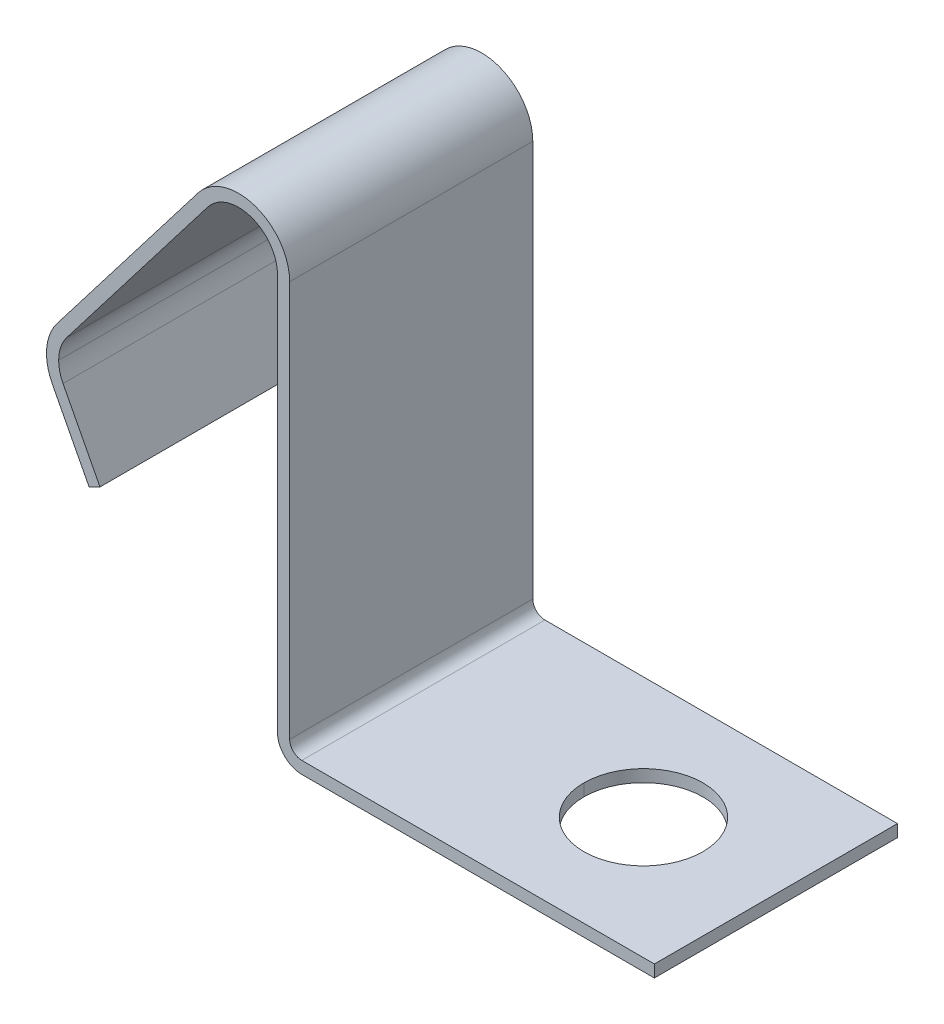
ISO-10303-21;
HEADER;
FILE_DESCRIPTION(('STEP AP214'),'2;1');
FILE_NAME('part.step','',(''),(''),'','','');
FILE_SCHEMA(('AUTOMOTIVE_DESIGN { 1 0 10303 214 1 1 1 1 }'));
ENDSEC;
DATA;
#1=APPLICATION_CONTEXT('core data for automotive mechanical design processes');
#2=APPLICATION_PROTOCOL_DEFINITION('international standard','automotive_design',2000,#1);
#3=PRODUCT_CONTEXT('',#1,'mechanical');
#4=PRODUCT('Part','Part','',(#3));
#5=PRODUCT_RELATED_PRODUCT_CATEGORY('part','',(#4));
#6=PRODUCT_DEFINITION_FORMATION('','',#4);
#7=PRODUCT_DEFINITION_CONTEXT('part definition',#1,'design');
#8=PRODUCT_DEFINITION('design','',#6,#7);
#9=PRODUCT_DEFINITION_SHAPE('','',#8);
#10=(LENGTH_UNIT() NAMED_UNIT(*) SI_UNIT(.MILLI.,.METRE.));
#11=(NAMED_UNIT(*) PLANE_ANGLE_UNIT() SI_UNIT($,.RADIAN.));
#12=(NAMED_UNIT(*) SI_UNIT($,.STERADIAN.) SOLID_ANGLE_UNIT());
#13=UNCERTAINTY_MEASURE_WITH_UNIT(LENGTH_MEASURE(1.E-05),#10,'distance_accuracy_value','');
#14=(GEOMETRIC_REPRESENTATION_CONTEXT(3) GLOBAL_UNCERTAINTY_ASSIGNED_CONTEXT((#13)) GLOBAL_UNIT_ASSIGNED_CONTEXT((#10,
#11,#12)) REPRESENTATION_CONTEXT('',''));
#15=CARTESIAN_POINT('',(0.,0.,0.));
#16=DIRECTION('',(0.,0.,1.));
#17=DIRECTION('',(1.,0.,0.));
#18=AXIS2_PLACEMENT_3D('',#15,#16,#17);
#19=CARTESIAN_POINT('',(-7.874,0.508,5.08));
#20=DIRECTION('',(-1.,0.,0.));
#21=DIRECTION('',(0.,0.,1.));
#22=AXIS2_PLACEMENT_3D('',#19,#20,#21);
#23=PLANE('',#22);
#24=DIRECTION('',(0.,1.,0.));
#25=VECTOR('',#24,1.);
#26=CARTESIAN_POINT('',(-7.874,0.508,5.08));
#27=LINE('',#26,#25);
#28=CARTESIAN_POINT('',(-7.874,0.508,5.08));
#29=VERTEX_POINT('',#28);
#30=CARTESIAN_POINT('',(-7.874,8.7884,5.08));
#31=VERTEX_POINT('',#30);
#32=EDGE_CURVE('E25',#29,#31,#27,.T.);
#33=ORIENTED_EDGE('',*,*,#32,.T.);
#34=DIRECTION('',(0.,0.,-1.));
#35=VECTOR('',#34,1.);
#36=CARTESIAN_POINT('',(-7.874,8.7884,5.08));
#37=LINE('',#36,#35);
#38=CARTESIAN_POINT('',(-7.874,8.7884,0.));
#39=VERTEX_POINT('',#38);
#40=EDGE_CURVE('E11',#31,#39,#37,.T.);
#41=ORIENTED_EDGE('',*,*,#40,.T.);
#42=DIRECTION('',(0.,-1.,0.));
#43=VECTOR('',#42,1.);
#44=CARTESIAN_POINT('',(-7.874,0.508,0.));
#45=LINE('',#44,#43);
#46=CARTESIAN_POINT('',(-7.874,0.508,0.));
#47=VERTEX_POINT('',#46);
#48=EDGE_CURVE('E407',#39,#47,#45,.T.);
#49=ORIENTED_EDGE('',*,*,#48,.T.);
#50=DIRECTION('',(0.,0.,1.));
#51=VECTOR('',#50,1.);
#52=CARTESIAN_POINT('',(-7.874,0.508,5.08));
#53=LINE('',#52,#51);
#54=EDGE_CURVE('E418',#47,#29,#53,.T.);
#55=ORIENTED_EDGE('',*,*,#54,.T.);
#56=EDGE_LOOP('',(#33,#41,#49,#55));
#57=FACE_BOUND('',#56,.T.);
#58=ADVANCED_FACE('F17',(#57),#23,.T.);
#59=CARTESIAN_POINT('',(-8.6868,8.7884,5.08));
#60=DIRECTION('',(0.,0.,-1.));
#61=DIRECTION('',(-1.,0.,0.));
#62=AXIS2_PLACEMENT_3D('',#59,#60,#61);
#63=CYLINDRICAL_SURFACE('',#62,0.8128);
#64=ORIENTED_EDGE('',*,*,#40,.F.);
#65=CARTESIAN_POINT('',(-8.6868,8.7884,5.08));
#66=DIRECTION('',(0.,0.,-1.));
#67=DIRECTION('',(-1.,0.,0.));
#68=AXIS2_PLACEMENT_3D('',#65,#66,#67);
#69=CIRCLE('',#68,0.8128);
#70=CARTESIAN_POINT('',(-9.33136201594556,9.2835602241701,5.08));
#71=VERTEX_POINT('',#70);
#72=EDGE_CURVE('E421',#71,#31,#69,.T.);
#73=ORIENTED_EDGE('',*,*,#72,.F.);
#74=DIRECTION('',(0.,0.,1.));
#75=VECTOR('',#74,1.);
#76=CARTESIAN_POINT('',(-9.33136201594557,9.2835602241701,5.08));
#77=LINE('',#76,#75);
#78=CARTESIAN_POINT('',(-9.33136201594556,9.2835602241701,0.));
#79=VERTEX_POINT('',#78);
#80=EDGE_CURVE('E400',#79,#71,#77,.T.);
#81=ORIENTED_EDGE('',*,*,#80,.F.);
#82=CARTESIAN_POINT('',(-8.6868,8.7884,0.));
#83=DIRECTION('',(0.,0.,1.));
#84=DIRECTION('',(-1.,0.,0.));
#85=AXIS2_PLACEMENT_3D('',#82,#83,#84);
#86=CIRCLE('',#85,0.8128);
#87=EDGE_CURVE('E411',#39,#79,#86,.T.);
#88=ORIENTED_EDGE('',*,*,#87,.F.);
#89=EDGE_LOOP('',(#64,#73,#81,#88));
#90=FACE_BOUND('',#89,.T.);
#91=ADVANCED_FACE('F428',(#90),#63,.F.);
#92=CARTESIAN_POINT('',(-7.366,0.254,5.08));
#93=DIRECTION('',(0.,0.,1.));
#94=DIRECTION('',(1.,0.,0.));
#95=AXIS2_PLACEMENT_3D('',#92,#93,#94);
#96=PLANE('',#95);
#97=DIRECTION('',(0.,1.,0.));
#98=VECTOR('',#97,1.);
#99=CARTESIAN_POINT('',(-7.62,0.254,5.08));
#100=LINE('',#99,#98);
#101=CARTESIAN_POINT('',(-7.62,0.508,5.08));
#102=VERTEX_POINT('',#101);
#103=CARTESIAN_POINT('',(-7.62,8.7884,5.08));
#104=VERTEX_POINT('',#103);
#105=EDGE_CURVE('E376',#102,#104,#100,.T.);
#106=ORIENTED_EDGE('',*,*,#105,.T.);
#107=CARTESIAN_POINT('',(-8.6868,8.7884,5.08));
#108=DIRECTION('',(0.,0.,1.));
#109=DIRECTION('',(-1.,0.,0.));
#110=AXIS2_PLACEMENT_3D('',#107,#108,#109);
#111=CIRCLE('',#110,1.0668);
#112=CARTESIAN_POINT('',(-9.53278764592855,9.43829779422325,5.08));
#113=VERTEX_POINT('',#112);
#114=EDGE_CURVE('E306',#104,#113,#111,.T.);
#115=ORIENTED_EDGE('',*,*,#114,.T.);
#116=DIRECTION('',(-0.609203031705345,-0.793014291271612,0.));
#117=VECTOR('',#116,1.);
#118=CARTESIAN_POINT('',(-9.53278764592855,9.43829779422325,5.08));
#119=LINE('',#118,#117);
#120=CARTESIAN_POINT('',(-12.4791876459286,5.60289779422326,5.08));
#121=VERTEX_POINT('',#120);
#122=EDGE_CURVE('E349',#113,#121,#119,.T.);
#123=ORIENTED_EDGE('',*,*,#122,.T.);
#124=CARTESIAN_POINT('',(-11.6332,4.953,5.08));
#125=DIRECTION('',(0.,0.,1.));
#126=DIRECTION('',(-1.,0.,0.));
#127=AXIS2_PLACEMENT_3D('',#124,#125,#126);
#128=CIRCLE('',#127,1.0668);
#129=CARTESIAN_POINT('',(-12.7,4.953,5.08));
#130=VERTEX_POINT('',#129);
#131=EDGE_CURVE('E322',#121,#130,#128,.T.);
#132=ORIENTED_EDGE('',*,*,#131,.T.);
#133=CARTESIAN_POINT('',(-11.6332,4.953,5.08));
#134=DIRECTION('',(0.,0.,1.));
#135=DIRECTION('',(-1.,0.,0.));
#136=AXIS2_PLACEMENT_3D('',#133,#134,#135);
#137=CIRCLE('',#136,1.0668);
#138=CARTESIAN_POINT('',(-12.5797372600589,4.46093348486189,5.08));
#139=VERTEX_POINT('',#138);
#140=EDGE_CURVE('E271',#130,#139,#137,.T.);
#141=ORIENTED_EDGE('',*,*,#140,.T.);
#142=DIRECTION('',(0.461254701104338,-0.887267772833629,0.));
#143=VECTOR('',#142,1.);
#144=CARTESIAN_POINT('',(-12.5797372600589,4.46093348486189,5.08));
#145=LINE('',#144,#143);
#146=CARTESIAN_POINT('',(-11.8077660142997,2.97597255920315,5.08));
#147=VERTEX_POINT('',#146);
#148=EDGE_CURVE('E276',#139,#147,#145,.T.);
#149=ORIENTED_EDGE('',*,*,#148,.T.);
#150=DIRECTION('',(-0.887267772833628,-0.46125470110434,0.));
#151=VECTOR('',#150,1.);
#152=CARTESIAN_POINT('',(-11.5824,3.09313125328365,5.08));
#153=LINE('',#152,#151);
#154=CARTESIAN_POINT('',(-11.5824,3.09313125328365,5.08));
#155=VERTEX_POINT('',#154);
#156=EDGE_CURVE('E263',#155,#147,#153,.T.);
#157=ORIENTED_EDGE('',*,*,#156,.F.);
#158=DIRECTION('',(0.461254701104338,-0.887267772833629,0.));
#159=VECTOR('',#158,1.);
#160=CARTESIAN_POINT('',(-12.3543712457592,4.57809217894239,5.08));
#161=LINE('',#160,#159);
#162=CARTESIAN_POINT('',(-12.3543712457592,4.57809217894239,5.08));
#163=VERTEX_POINT('',#162);
#164=EDGE_CURVE('E206',#163,#155,#161,.T.);
#165=ORIENTED_EDGE('',*,*,#164,.F.);
#166=CARTESIAN_POINT('',(-11.6332,4.953,5.08));
#167=DIRECTION('',(0.,0.,-1.));
#168=DIRECTION('',(-1.,0.,0.));
#169=AXIS2_PLACEMENT_3D('',#166,#167,#168);
#170=CIRCLE('',#169,0.8128);
#171=CARTESIAN_POINT('',(-12.446,4.953,5.08));
#172=VERTEX_POINT('',#171);
#173=EDGE_CURVE('E199',#163,#172,#170,.T.);
#174=ORIENTED_EDGE('',*,*,#173,.T.);
#175=CARTESIAN_POINT('',(-11.6332,4.953,5.08));
#176=DIRECTION('',(0.,0.,-1.));
#177=DIRECTION('',(-1.,0.,0.));
#178=AXIS2_PLACEMENT_3D('',#175,#176,#177);
#179=CIRCLE('',#178,0.8128);
#180=CARTESIAN_POINT('',(-12.2777620159456,5.4481602241701,5.08));
#181=VERTEX_POINT('',#180);
#182=EDGE_CURVE('E204',#172,#181,#179,.T.);
#183=ORIENTED_EDGE('',*,*,#182,.T.);
#184=DIRECTION('',(-0.609203031705345,-0.793014291271612,0.));
#185=VECTOR('',#184,1.);
#186=CARTESIAN_POINT('',(-9.33136201594556,9.2835602241701,5.08));
#187=LINE('',#186,#185);
#188=EDGE_CURVE('E393',#71,#181,#187,.T.);
#189=ORIENTED_EDGE('',*,*,#188,.F.);
#190=ORIENTED_EDGE('',*,*,#72,.T.);
#191=ORIENTED_EDGE('',*,*,#32,.F.);
#192=CARTESIAN_POINT('',(-7.366,0.508,5.08));
#193=DIRECTION('',(0.,0.,-1.));
#194=DIRECTION('',(-1.,0.,0.));
#195=AXIS2_PLACEMENT_3D('',#192,#193,#194);
#196=CIRCLE('',#195,0.508);
#197=CARTESIAN_POINT('',(-7.366,0.,5.08));
#198=VERTEX_POINT('',#197);
#199=EDGE_CURVE('E414',#198,#29,#196,.T.);
#200=ORIENTED_EDGE('',*,*,#199,.F.);
#201=DIRECTION('',(-1.,0.,0.));
#202=VECTOR('',#201,1.);
#203=CARTESIAN_POINT('',(0.,0.,5.08));
#204=LINE('',#203,#202);
#205=CARTESIAN_POINT('',(0.,0.,5.08));
#206=VERTEX_POINT('',#205);
#207=EDGE_CURVE('E248',#206,#198,#204,.T.);
#208=ORIENTED_EDGE('',*,*,#207,.F.);
#209=DIRECTION('',(0.,1.,0.));
#210=VECTOR('',#209,1.);
#211=CARTESIAN_POINT('',(0.,4.953,5.08));
#212=LINE('',#211,#210);
#213=CARTESIAN_POINT('',(0.,0.254,5.08));
#214=VERTEX_POINT('',#213);
#215=EDGE_CURVE('E254',#206,#214,#212,.T.);
#216=ORIENTED_EDGE('',*,*,#215,.T.);
#217=DIRECTION('',(-1.,0.,0.));
#218=VECTOR('',#217,1.);
#219=CARTESIAN_POINT('',(-11.6332,0.254,5.08));
#220=LINE('',#219,#218);
#221=CARTESIAN_POINT('',(-7.366,0.254,5.08));
#222=VERTEX_POINT('',#221);
#223=EDGE_CURVE('E334',#214,#222,#220,.T.);
#224=ORIENTED_EDGE('',*,*,#223,.T.);
#225=CARTESIAN_POINT('',(-7.366,0.508,5.08));
#226=DIRECTION('',(0.,0.,-1.));
#227=DIRECTION('',(-1.,0.,0.));
#228=AXIS2_PLACEMENT_3D('',#225,#226,#227);
#229=CIRCLE('',#228,0.254);
#230=EDGE_CURVE('E350',#222,#102,#229,.T.);
#231=ORIENTED_EDGE('',*,*,#230,.T.);
#232=EDGE_LOOP('',(#106,#115,#123,#132,#141,#149,#157,#165,#174,#183,#189,#190,#191,#200,#208,
#216,#224,#231));
#233=FACE_BOUND('',#232,.T.);
#234=ADVANCED_FACE('F201',(#233),#96,.T.);
#235=CARTESIAN_POINT('',(-7.366,0.508,5.08));
#236=DIRECTION('',(0.,0.,-1.));
#237=DIRECTION('',(-1.,0.,0.));
#238=AXIS2_PLACEMENT_3D('',#235,#236,#237);
#239=CYLINDRICAL_SURFACE('',#238,0.508);
#240=ORIENTED_EDGE('',*,*,#199,.T.);
#241=ORIENTED_EDGE('',*,*,#54,.F.);
#242=CARTESIAN_POINT('',(-7.366,0.508,0.));
#243=DIRECTION('',(0.,0.,1.));
#244=DIRECTION('',(-1.,0.,0.));
#245=AXIS2_PLACEMENT_3D('',#242,#243,#244);
#246=CIRCLE('',#245,0.508);
#247=CARTESIAN_POINT('',(-7.366,0.,0.));
#248=VERTEX_POINT('',#247);
#249=EDGE_CURVE('E404',#47,#248,#246,.T.);
#250=ORIENTED_EDGE('',*,*,#249,.T.);
#251=DIRECTION('',(0.,0.,1.));
#252=VECTOR('',#251,1.);
#253=CARTESIAN_POINT('',(-7.366,0.,5.08));
#254=LINE('',#253,#252);
#255=EDGE_CURVE('E252',#248,#198,#254,.T.);
#256=ORIENTED_EDGE('',*,*,#255,.T.);
#257=EDGE_LOOP('',(#240,#241,#250,#256));
#258=FACE_BOUND('',#257,.T.);
#259=ADVANCED_FACE('F439',(#258),#239,.T.);
#260=CARTESIAN_POINT('',(-9.53278764592855,9.43829779422325,0.));
#261=DIRECTION('',(0.,0.,-1.));
#262=DIRECTION('',(0.,-1.,0.));
#263=AXIS2_PLACEMENT_3D('',#260,#261,#262);
#264=PLANE('',#263);
#265=DIRECTION('',(0.,-1.,0.));
#266=VECTOR('',#265,1.);
#267=CARTESIAN_POINT('',(-7.62,9.43829779422325,0.));
#268=LINE('',#267,#266);
#269=CARTESIAN_POINT('',(-7.62,8.7884,0.));
#270=VERTEX_POINT('',#269);
#271=CARTESIAN_POINT('',(-7.62,0.508,0.));
#272=VERTEX_POINT('',#271);
#273=EDGE_CURVE('E390',#270,#272,#268,.T.);
#274=ORIENTED_EDGE('',*,*,#273,.T.);
#275=CARTESIAN_POINT('',(-7.366,0.508,0.));
#276=DIRECTION('',(0.,0.,1.));
#277=DIRECTION('',(-1.,0.,0.));
#278=AXIS2_PLACEMENT_3D('',#275,#276,#277);
#279=CIRCLE('',#278,0.254);
#280=CARTESIAN_POINT('',(-7.366,0.254,0.));
#281=VERTEX_POINT('',#280);
#282=EDGE_CURVE('E212',#272,#281,#279,.T.);
#283=ORIENTED_EDGE('',*,*,#282,.T.);
#284=DIRECTION('',(1.,0.,0.));
#285=VECTOR('',#284,1.);
#286=CARTESIAN_POINT('',(-7.62,0.254,0.));
#287=LINE('',#286,#285);
#288=CARTESIAN_POINT('',(0.,0.254,0.));
#289=VERTEX_POINT('',#288);
#290=EDGE_CURVE('E342',#281,#289,#287,.T.);
#291=ORIENTED_EDGE('',*,*,#290,.T.);
#292=DIRECTION('',(0.,1.,0.));
#293=VECTOR('',#292,1.);
#294=CARTESIAN_POINT('',(0.,0.254,0.));
#295=LINE('',#294,#293);
#296=CARTESIAN_POINT('',(0.,0.,0.));
#297=VERTEX_POINT('',#296);
#298=EDGE_CURVE('E297',#297,#289,#295,.T.);
#299=ORIENTED_EDGE('',*,*,#298,.F.);
#300=DIRECTION('',(1.,0.,0.));
#301=VECTOR('',#300,1.);
#302=CARTESIAN_POINT('',(0.,0.,0.));
#303=LINE('',#302,#301);
#304=EDGE_CURVE('E374',#248,#297,#303,.T.);
#305=ORIENTED_EDGE('',*,*,#304,.F.);
#306=ORIENTED_EDGE('',*,*,#249,.F.);
#307=ORIENTED_EDGE('',*,*,#48,.F.);
#308=ORIENTED_EDGE('',*,*,#87,.T.);
#309=DIRECTION('',(0.609203031705345,0.793014291271612,0.));
#310=VECTOR('',#309,1.);
#311=CARTESIAN_POINT('',(-9.33136201594556,9.2835602241701,0.));
#312=LINE('',#311,#310);
#313=CARTESIAN_POINT('',(-12.2777620159456,5.4481602241701,0.));
#314=VERTEX_POINT('',#313);
#315=EDGE_CURVE('E396',#314,#79,#312,.T.);
#316=ORIENTED_EDGE('',*,*,#315,.F.);
#317=CARTESIAN_POINT('',(-11.6332,4.953,0.));
#318=DIRECTION('',(0.,0.,1.));
#319=DIRECTION('',(-1.,0.,0.));
#320=AXIS2_PLACEMENT_3D('',#317,#318,#319);
#321=CIRCLE('',#320,0.8128);
#322=CARTESIAN_POINT('',(-12.446,4.953,0.));
#323=VERTEX_POINT('',#322);
#324=EDGE_CURVE('E221',#314,#323,#321,.T.);
#325=ORIENTED_EDGE('',*,*,#324,.T.);
#326=CARTESIAN_POINT('',(-11.6332,4.953,0.));
#327=DIRECTION('',(0.,0.,1.));
#328=DIRECTION('',(-1.,0.,0.));
#329=AXIS2_PLACEMENT_3D('',#326,#327,#328);
#330=CIRCLE('',#329,0.8128);
#331=CARTESIAN_POINT('',(-12.3543712457592,4.57809217894239,0.));
#332=VERTEX_POINT('',#331);
#333=EDGE_CURVE('E211',#323,#332,#330,.T.);
#334=ORIENTED_EDGE('',*,*,#333,.T.);
#335=DIRECTION('',(-0.461254701104338,0.887267772833629,0.));
#336=VECTOR('',#335,1.);
#337=CARTESIAN_POINT('',(-12.3543712457592,4.57809217894239,0.));
#338=LINE('',#337,#336);
#339=CARTESIAN_POINT('',(-11.5824,3.09313125328365,0.));
#340=VERTEX_POINT('',#339);
#341=EDGE_CURVE('E318',#340,#332,#338,.T.);
#342=ORIENTED_EDGE('',*,*,#341,.F.);
#343=DIRECTION('',(0.887267772833628,0.46125470110434,0.));
#344=VECTOR('',#343,1.);
#345=CARTESIAN_POINT('',(-11.5824,3.09313125328365,0.));
#346=LINE('',#345,#344);
#347=CARTESIAN_POINT('',(-11.8077660142997,2.97597255920315,0.));
#348=VERTEX_POINT('',#347);
#349=EDGE_CURVE('E266',#348,#340,#346,.T.);
#350=ORIENTED_EDGE('',*,*,#349,.F.);
#351=DIRECTION('',(0.461254701104338,-0.887267772833629,0.));
#352=VECTOR('',#351,1.);
#353=CARTESIAN_POINT('',(-12.5797372600589,4.46093348486189,0.));
#354=LINE('',#353,#352);
#355=CARTESIAN_POINT('',(-12.5797372600589,4.46093348486189,0.));
#356=VERTEX_POINT('',#355);
#357=EDGE_CURVE('E267',#356,#348,#354,.T.);
#358=ORIENTED_EDGE('',*,*,#357,.F.);
#359=CARTESIAN_POINT('',(-11.6332,4.953,0.));
#360=DIRECTION('',(0.,0.,-1.));
#361=DIRECTION('',(-1.,0.,0.));
#362=AXIS2_PLACEMENT_3D('',#359,#360,#361);
#363=CIRCLE('',#362,1.0668);
#364=CARTESIAN_POINT('',(-12.7,4.953,0.));
#365=VERTEX_POINT('',#364);
#366=EDGE_CURVE('E284',#356,#365,#363,.T.);
#367=ORIENTED_EDGE('',*,*,#366,.T.);
#368=CARTESIAN_POINT('',(-11.6332,4.953,0.));
#369=DIRECTION('',(0.,0.,-1.));
#370=DIRECTION('',(-1.,0.,0.));
#371=AXIS2_PLACEMENT_3D('',#368,#369,#370);
#372=CIRCLE('',#371,1.0668);
#373=CARTESIAN_POINT('',(-12.4791876459286,5.60289779422326,0.));
#374=VERTEX_POINT('',#373);
#375=EDGE_CURVE('E307',#365,#374,#372,.T.);
#376=ORIENTED_EDGE('',*,*,#375,.T.);
#377=DIRECTION('',(0.609203031705345,0.793014291271612,0.));
#378=VECTOR('',#377,1.);
#379=CARTESIAN_POINT('',(-12.4791876459286,5.60289779422326,0.));
#380=LINE('',#379,#378);
#381=CARTESIAN_POINT('',(-9.53278764592855,9.43829779422325,0.));
#382=VERTEX_POINT('',#381);
#383=EDGE_CURVE('E361',#374,#382,#380,.T.);
#384=ORIENTED_EDGE('',*,*,#383,.T.);
#385=CARTESIAN_POINT('',(-8.6868,8.7884,0.));
#386=DIRECTION('',(0.,0.,-1.));
#387=DIRECTION('',(-1.,0.,0.));
#388=AXIS2_PLACEMENT_3D('',#385,#386,#387);
#389=CIRCLE('',#388,1.0668);
#390=EDGE_CURVE('E253',#382,#270,#389,.T.);
#391=ORIENTED_EDGE('',*,*,#390,.T.);
#392=EDGE_LOOP('',(#274,#283,#291,#299,#305,#306,#307,#308,#316,#325,#334,#342,#350,#358,#367,
#376,#384,#391));
#393=FACE_BOUND('',#392,.T.);
#394=ADVANCED_FACE('F432',(#393),#264,.T.);
#395=CARTESIAN_POINT('',(-9.33136201594556,9.2835602241701,5.08));
#396=DIRECTION('',(0.793014291271612,-0.609203031705345,0.));
#397=DIRECTION('',(0.,0.,-1.));
#398=AXIS2_PLACEMENT_3D('',#395,#396,#397);
#399=PLANE('',#398);
#400=ORIENTED_EDGE('',*,*,#188,.T.);
#401=DIRECTION('',(0.,0.,-1.));
#402=VECTOR('',#401,1.);
#403=CARTESIAN_POINT('',(-12.2777620159456,5.4481602241701,5.08));
#404=LINE('',#403,#402);
#405=EDGE_CURVE('E226',#181,#314,#404,.T.);
#406=ORIENTED_EDGE('',*,*,#405,.T.);
#407=ORIENTED_EDGE('',*,*,#315,.T.);
#408=ORIENTED_EDGE('',*,*,#80,.T.);
#409=EDGE_LOOP('',(#400,#406,#407,#408));
#410=FACE_BOUND('',#409,.T.);
#411=ADVANCED_FACE('F430',(#410),#399,.T.);
#412=CARTESIAN_POINT('',(-7.62,0.508,5.08));
#413=DIRECTION('',(-1.,0.,0.));
#414=DIRECTION('',(0.,0.,1.));
#415=AXIS2_PLACEMENT_3D('',#412,#413,#414);
#416=PLANE('',#415);
#417=DIRECTION('',(0.,0.,-1.));
#418=VECTOR('',#417,1.);
#419=CARTESIAN_POINT('',(-7.62,8.7884,5.08));
#420=LINE('',#419,#418);
#421=EDGE_CURVE('E302',#104,#270,#420,.T.);
#422=ORIENTED_EDGE('',*,*,#421,.F.);
#423=ORIENTED_EDGE('',*,*,#105,.F.);
#424=DIRECTION('',(0.,0.,1.));
#425=VECTOR('',#424,1.);
#426=CARTESIAN_POINT('',(-7.62,0.508,5.08));
#427=LINE('',#426,#425);
#428=EDGE_CURVE('E354',#272,#102,#427,.T.);
#429=ORIENTED_EDGE('',*,*,#428,.F.);
#430=ORIENTED_EDGE('',*,*,#273,.F.);
#431=EDGE_LOOP('',(#422,#423,#429,#430));
#432=FACE_BOUND('',#431,.T.);
#433=ADVANCED_FACE('F458',(#432),#416,.F.);
#434=CARTESIAN_POINT('',(0.,0.,5.08));
#435=DIRECTION('',(0.,-1.,0.));
#436=DIRECTION('',(0.,0.,-1.));
#437=AXIS2_PLACEMENT_3D('',#434,#435,#436);
#438=PLANE('',#437);
#439=CARTESIAN_POINT('',(-2.7686,0.,2.54));
#440=DIRECTION('',(0.,1.,0.));
#441=DIRECTION('',(-1.,0.,0.));
#442=AXIS2_PLACEMENT_3D('',#439,#440,#441);
#443=CIRCLE('',#442,1.2446);
#444=CARTESIAN_POINT('',(-4.0132,0.,2.54));
#445=VERTEX_POINT('',#444);
#446=CARTESIAN_POINT('',(-1.524,0.,2.54));
#447=VERTEX_POINT('',#446);
#448=EDGE_CURVE('E258',#445,#447,#443,.T.);
#449=ORIENTED_EDGE('',*,*,#448,.T.);
#450=CARTESIAN_POINT('',(-2.7686,0.,2.54));
#451=DIRECTION('',(0.,1.,0.));
#452=DIRECTION('',(-1.,0.,0.));
#453=AXIS2_PLACEMENT_3D('',#450,#451,#452);
#454=CIRCLE('',#453,1.2446);
#455=EDGE_CURVE('E239',#447,#445,#454,.T.);
#456=ORIENTED_EDGE('',*,*,#455,.T.);
#457=EDGE_LOOP('',(#449,#456));
#458=FACE_BOUND('',#457,.T.);
#459=ORIENTED_EDGE('',*,*,#207,.T.);
#460=ORIENTED_EDGE('',*,*,#255,.F.);
#461=ORIENTED_EDGE('',*,*,#304,.T.);
#462=DIRECTION('',(0.,0.,1.));
#463=VECTOR('',#462,1.);
#464=CARTESIAN_POINT('',(0.,0.,5.08));
#465=LINE('',#464,#463);
#466=EDGE_CURVE('E257',#297,#206,#465,.T.);
#467=ORIENTED_EDGE('',*,*,#466,.T.);
#468=EDGE_LOOP('',(#459,#460,#461,#467));
#469=FACE_BOUND('',#468,.T.);
#470=ADVANCED_FACE('F443',(#458,#469),#438,.T.);
#471=CARTESIAN_POINT('',(-8.6868,8.7884,5.08));
#472=DIRECTION('',(0.,0.,-1.));
#473=DIRECTION('',(-1.,0.,0.));
#474=AXIS2_PLACEMENT_3D('',#471,#472,#473);
#475=CYLINDRICAL_SURFACE('',#474,1.0668);
#476=ORIENTED_EDGE('',*,*,#114,.F.);
#477=ORIENTED_EDGE('',*,*,#421,.T.);
#478=ORIENTED_EDGE('',*,*,#390,.F.);
#479=DIRECTION('',(0.,0.,1.));
#480=VECTOR('',#479,1.);
#481=CARTESIAN_POINT('',(-9.53278764592855,9.43829779422325,5.08));
#482=LINE('',#481,#480);
#483=EDGE_CURVE('E357',#382,#113,#482,.T.);
#484=ORIENTED_EDGE('',*,*,#483,.T.);
#485=EDGE_LOOP('',(#476,#477,#478,#484));
#486=FACE_BOUND('',#485,.T.);
#487=ADVANCED_FACE('F461',(#486),#475,.T.);
#488=CARTESIAN_POINT('',(-11.6332,4.953,5.08));
#489=DIRECTION('',(0.,0.,-1.));
#490=DIRECTION('',(-1.,0.,0.));
#491=AXIS2_PLACEMENT_3D('',#488,#489,#490);
#492=CYLINDRICAL_SURFACE('',#491,0.8128);
#493=DIRECTION('',(0.,0.,-1.));
#494=VECTOR('',#493,1.);
#495=CARTESIAN_POINT('',(-12.446,4.953,5.08));
#496=LINE('',#495,#494);
#497=EDGE_CURVE('E215',#172,#323,#496,.T.);
#498=ORIENTED_EDGE('',*,*,#497,.F.);
#499=ORIENTED_EDGE('',*,*,#173,.F.);
#500=DIRECTION('',(0.,0.,1.));
#501=VECTOR('',#500,1.);
#502=CARTESIAN_POINT('',(-12.3543712457592,4.57809217894239,5.08));
#503=LINE('',#502,#501);
#504=EDGE_CURVE('E319',#332,#163,#503,.T.);
#505=ORIENTED_EDGE('',*,*,#504,.F.);
#506=ORIENTED_EDGE('',*,*,#333,.F.);
#507=EDGE_LOOP('',(#498,#499,#505,#506));
#508=FACE_BOUND('',#507,.T.);
#509=ADVANCED_FACE('F216',(#508),#492,.F.);
#510=CARTESIAN_POINT('',(-7.366,0.508,5.08));
#511=DIRECTION('',(0.,0.,-1.));
#512=DIRECTION('',(-1.,0.,0.));
#513=AXIS2_PLACEMENT_3D('',#510,#511,#512);
#514=CYLINDRICAL_SURFACE('',#513,0.254);
#515=ORIENTED_EDGE('',*,*,#428,.T.);
#516=ORIENTED_EDGE('',*,*,#230,.F.);
#517=DIRECTION('',(0.,0.,1.));
#518=VECTOR('',#517,1.);
#519=CARTESIAN_POINT('',(-7.366,0.254,5.08));
#520=LINE('',#519,#518);
#521=EDGE_CURVE('E311',#281,#222,#520,.T.);
#522=ORIENTED_EDGE('',*,*,#521,.F.);
#523=ORIENTED_EDGE('',*,*,#282,.F.);
#524=EDGE_LOOP('',(#515,#516,#522,#523));
#525=FACE_BOUND('',#524,.T.);
#526=ADVANCED_FACE('F456',(#525),#514,.F.);
#527=CARTESIAN_POINT('',(0.,0.254,5.08));
#528=DIRECTION('',(1.,0.,0.));
#529=DIRECTION('',(0.,1.,0.));
#530=AXIS2_PLACEMENT_3D('',#527,#528,#529);
#531=PLANE('',#530);
#532=ORIENTED_EDGE('',*,*,#215,.F.);
#533=ORIENTED_EDGE('',*,*,#466,.F.);
#534=ORIENTED_EDGE('',*,*,#298,.T.);
#535=DIRECTION('',(0.,0.,1.));
#536=VECTOR('',#535,1.);
#537=CARTESIAN_POINT('',(0.,0.254,5.08));
#538=LINE('',#537,#536);
#539=EDGE_CURVE('E338',#289,#214,#538,.T.);
#540=ORIENTED_EDGE('',*,*,#539,.T.);
#541=EDGE_LOOP('',(#532,#533,#534,#540));
#542=FACE_BOUND('',#541,.T.);
#543=ADVANCED_FACE('F445',(#542),#531,.T.);
#544=CARTESIAN_POINT('',(-2.7686,-0.0254,2.54));
#545=DIRECTION('',(0.,1.,0.));
#546=DIRECTION('',(-1.,0.,0.));
#547=AXIS2_PLACEMENT_3D('',#544,#545,#546);
#548=CYLINDRICAL_SURFACE('',#547,1.2446);
#549=DIRECTION('',(0.,1.,0.));
#550=VECTOR('',#549,1.);
#551=CARTESIAN_POINT('',(-1.524,-0.0254,2.54));
#552=LINE('',#551,#550);
#553=CARTESIAN_POINT('',(-1.524,0.254,2.54));
#554=VERTEX_POINT('',#553);
#555=EDGE_CURVE('E240',#447,#554,#552,.T.);
#556=ORIENTED_EDGE('',*,*,#555,.F.);
#557=ORIENTED_EDGE('',*,*,#448,.F.);
#558=DIRECTION('',(0.,1.,0.));
#559=VECTOR('',#558,1.);
#560=CARTESIAN_POINT('',(-4.0132,-0.0254000000000004,2.54));
#561=LINE('',#560,#559);
#562=CARTESIAN_POINT('',(-4.0132,0.254,2.54));
#563=VERTEX_POINT('',#562);
#564=EDGE_CURVE('E262',#445,#563,#561,.T.);
#565=ORIENTED_EDGE('',*,*,#564,.T.);
#566=CARTESIAN_POINT('',(-2.7686,0.254,2.54));
#567=DIRECTION('',(0.,-1.,0.));
#568=DIRECTION('',(-1.,0.,0.));
#569=AXIS2_PLACEMENT_3D('',#566,#567,#568);
#570=CIRCLE('',#569,1.2446);
#571=EDGE_CURVE('E346',#554,#563,#570,.T.);
#572=ORIENTED_EDGE('',*,*,#571,.F.);
#573=EDGE_LOOP('',(#556,#557,#565,#572));
#574=FACE_BOUND('',#573,.T.);
#575=ADVANCED_FACE('F744',(#574),#548,.F.);
#576=CARTESIAN_POINT('',(-9.53278764592855,9.43829779422325,5.08));
#577=DIRECTION('',(0.793014291271612,-0.609203031705345,0.));
#578=DIRECTION('',(0.,0.,-1.));
#579=AXIS2_PLACEMENT_3D('',#576,#577,#578);
#580=PLANE('',#579);
#581=DIRECTION('',(0.,0.,-1.));
#582=VECTOR('',#581,1.);
#583=CARTESIAN_POINT('',(-12.4791876459286,5.60289779422326,5.08));
#584=LINE('',#583,#582);
#585=EDGE_CURVE('E312',#121,#374,#584,.T.);
#586=ORIENTED_EDGE('',*,*,#585,.F.);
#587=ORIENTED_EDGE('',*,*,#122,.F.);
#588=ORIENTED_EDGE('',*,*,#483,.F.);
#589=ORIENTED_EDGE('',*,*,#383,.F.);
#590=EDGE_LOOP('',(#586,#587,#588,#589));
#591=FACE_BOUND('',#590,.T.);
#592=ADVANCED_FACE('F468',(#591),#580,.F.);
#593=CARTESIAN_POINT('',(0.,0.254,5.08));
#594=DIRECTION('',(0.,-1.,0.));
#595=DIRECTION('',(0.,0.,-1.));
#596=AXIS2_PLACEMENT_3D('',#593,#594,#595);
#597=PLANE('',#596);
#598=CARTESIAN_POINT('',(-2.7686,0.254,2.54));
#599=DIRECTION('',(0.,-1.,0.));
#600=DIRECTION('',(-1.,0.,0.));
#601=AXIS2_PLACEMENT_3D('',#598,#599,#600);
#602=CIRCLE('',#601,1.2446);
#603=EDGE_CURVE('E244',#563,#554,#602,.T.);
#604=ORIENTED_EDGE('',*,*,#603,.T.);
#605=ORIENTED_EDGE('',*,*,#571,.T.);
#606=EDGE_LOOP('',(#604,#605));
#607=FACE_BOUND('',#606,.T.);
#608=ORIENTED_EDGE('',*,*,#521,.T.);
#609=ORIENTED_EDGE('',*,*,#223,.F.);
#610=ORIENTED_EDGE('',*,*,#539,.F.);
#611=ORIENTED_EDGE('',*,*,#290,.F.);
#612=EDGE_LOOP('',(#608,#609,#610,#611));
#613=FACE_BOUND('',#612,.T.);
#614=ADVANCED_FACE('F450',(#607,#613),#597,.F.);
#615=CARTESIAN_POINT('',(-11.6332,4.953,5.08));
#616=DIRECTION('',(0.,0.,-1.));
#617=DIRECTION('',(-1.,0.,0.));
#618=AXIS2_PLACEMENT_3D('',#615,#616,#617);
#619=CYLINDRICAL_SURFACE('',#618,1.0668);
#620=DIRECTION('',(0.,0.,-1.));
#621=VECTOR('',#620,1.);
#622=CARTESIAN_POINT('',(-12.7,4.953,5.08));
#623=LINE('',#622,#621);
#624=EDGE_CURVE('E280',#130,#365,#623,.T.);
#625=ORIENTED_EDGE('',*,*,#624,.F.);
#626=ORIENTED_EDGE('',*,*,#131,.F.);
#627=ORIENTED_EDGE('',*,*,#585,.T.);
#628=ORIENTED_EDGE('',*,*,#375,.F.);
#629=EDGE_LOOP('',(#625,#626,#627,#628));
#630=FACE_BOUND('',#629,.T.);
#631=ADVANCED_FACE('F470',(#630),#619,.T.);
#632=CARTESIAN_POINT('',(-12.3543712457592,4.57809217894239,5.08));
#633=DIRECTION('',(0.887267772833629,0.461254701104338,0.));
#634=DIRECTION('',(0.,0.,-1.));
#635=AXIS2_PLACEMENT_3D('',#632,#633,#634);
#636=PLANE('',#635);
#637=ORIENTED_EDGE('',*,*,#164,.T.);
#638=DIRECTION('',(0.,0.,-1.));
#639=VECTOR('',#638,1.);
#640=CARTESIAN_POINT('',(-11.5824,3.09313125328365,5.08));
#641=LINE('',#640,#639);
#642=EDGE_CURVE('E301',#155,#340,#641,.T.);
#643=ORIENTED_EDGE('',*,*,#642,.T.);
#644=ORIENTED_EDGE('',*,*,#341,.T.);
#645=ORIENTED_EDGE('',*,*,#504,.T.);
#646=EDGE_LOOP('',(#637,#643,#644,#645));
#647=FACE_BOUND('',#646,.T.);
#648=ADVANCED_FACE('F484',(#647),#636,.T.);
#649=CARTESIAN_POINT('',(-11.5824,3.09313125328365,5.08));
#650=DIRECTION('',(0.46125470110434,-0.887267772833628,0.));
#651=DIRECTION('',(0.,0.,-1.));
#652=AXIS2_PLACEMENT_3D('',#649,#650,#651);
#653=PLANE('',#652);
#654=ORIENTED_EDGE('',*,*,#156,.T.);
#655=DIRECTION('',(0.,0.,-1.));
#656=VECTOR('',#655,1.);
#657=CARTESIAN_POINT('',(-11.8077660142997,2.97597255920315,5.08));
#658=LINE('',#657,#656);
#659=EDGE_CURVE('E272',#147,#348,#658,.T.);
#660=ORIENTED_EDGE('',*,*,#659,.T.);
#661=ORIENTED_EDGE('',*,*,#349,.T.);
#662=ORIENTED_EDGE('',*,*,#642,.F.);
#663=EDGE_LOOP('',(#654,#660,#661,#662));
#664=FACE_BOUND('',#663,.T.);
#665=ADVANCED_FACE('F481',(#664),#653,.T.);
#666=CARTESIAN_POINT('',(-12.5797372600589,4.46093348486189,5.08));
#667=DIRECTION('',(0.887267772833629,0.461254701104338,0.));
#668=DIRECTION('',(0.,0.,-1.));
#669=AXIS2_PLACEMENT_3D('',#666,#667,#668);
#670=PLANE('',#669);
#671=ORIENTED_EDGE('',*,*,#659,.F.);
#672=ORIENTED_EDGE('',*,*,#148,.F.);
#673=DIRECTION('',(0.,0.,1.));
#674=VECTOR('',#673,1.);
#675=CARTESIAN_POINT('',(-12.5797372600589,4.46093348486189,5.08));
#676=LINE('',#675,#674);
#677=EDGE_CURVE('E233',#356,#139,#676,.T.);
#678=ORIENTED_EDGE('',*,*,#677,.F.);
#679=ORIENTED_EDGE('',*,*,#357,.T.);
#680=EDGE_LOOP('',(#671,#672,#678,#679));
#681=FACE_BOUND('',#680,.T.);
#682=ADVANCED_FACE('F479',(#681),#670,.F.);
#683=CARTESIAN_POINT('',(-11.6332,4.953,5.08));
#684=DIRECTION('',(0.,0.,-1.));
#685=DIRECTION('',(-1.,0.,0.));
#686=AXIS2_PLACEMENT_3D('',#683,#684,#685);
#687=CYLINDRICAL_SURFACE('',#686,1.0668);
#688=ORIENTED_EDGE('',*,*,#140,.F.);
#689=ORIENTED_EDGE('',*,*,#624,.T.);
#690=ORIENTED_EDGE('',*,*,#366,.F.);
#691=ORIENTED_EDGE('',*,*,#677,.T.);
#692=EDGE_LOOP('',(#688,#689,#690,#691));
#693=FACE_BOUND('',#692,.T.);
#694=ADVANCED_FACE('F475',(#693),#687,.T.);
#695=CARTESIAN_POINT('',(-2.7686,-0.0254,2.54));
#696=DIRECTION('',(0.,1.,0.));
#697=DIRECTION('',(-1.,0.,0.));
#698=AXIS2_PLACEMENT_3D('',#695,#696,#697);
#699=CYLINDRICAL_SURFACE('',#698,1.2446);
#700=ORIENTED_EDGE('',*,*,#455,.F.);
#701=ORIENTED_EDGE('',*,*,#555,.T.);
#702=ORIENTED_EDGE('',*,*,#603,.F.);
#703=ORIENTED_EDGE('',*,*,#564,.F.);
#704=EDGE_LOOP('',(#700,#701,#702,#703));
#705=FACE_BOUND('',#704,.T.);
#706=ADVANCED_FACE('F671',(#705),#699,.F.);
#707=CARTESIAN_POINT('',(-11.6332,4.953,5.08));
#708=DIRECTION('',(0.,0.,-1.));
#709=DIRECTION('',(-1.,0.,0.));
#710=AXIS2_PLACEMENT_3D('',#707,#708,#709);
#711=CYLINDRICAL_SURFACE('',#710,0.8128);
#712=ORIENTED_EDGE('',*,*,#182,.F.);
#713=ORIENTED_EDGE('',*,*,#497,.T.);
#714=ORIENTED_EDGE('',*,*,#324,.F.);
#715=ORIENTED_EDGE('',*,*,#405,.F.);
#716=EDGE_LOOP('',(#712,#713,#714,#715));
#717=FACE_BOUND('',#716,.T.);
#718=ADVANCED_FACE('F224',(#717),#711,.F.);
#719=CLOSED_SHELL('',(#58,#91,#234,#259,#394,#411,#433,#470,#487,#509,#526,#543,#575,#592,#614,
#631,#648,#665,#682,#694,#706,#718));
#720=MANIFOLD_SOLID_BREP('B1',#719);
#721=ADVANCED_BREP_SHAPE_REPRESENTATION('',(#18,#720),#14);
#722=SHAPE_DEFINITION_REPRESENTATION(#9,#721);
ENDSEC;
END-ISO-10303-21;
